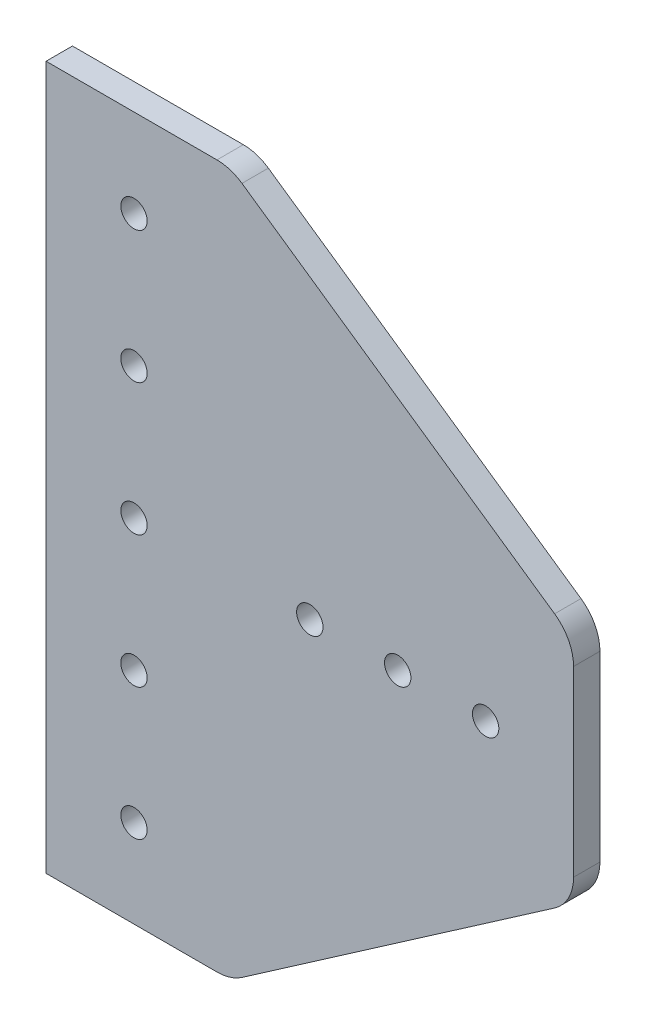
ISO-10303-21;
HEADER;
FILE_DESCRIPTION(('STEP AP214'),'2;1');
FILE_NAME('part.step','',(''),(''),'','','');
FILE_SCHEMA(('AUTOMOTIVE_DESIGN { 1 0 10303 214 1 1 1 1 }'));
ENDSEC;
DATA;
#1=APPLICATION_CONTEXT('core data for automotive mechanical design processes');
#2=APPLICATION_PROTOCOL_DEFINITION('international standard','automotive_design',2000,#1);
#3=PRODUCT_CONTEXT('',#1,'mechanical');
#4=PRODUCT('Part','Part','',(#3));
#5=PRODUCT_RELATED_PRODUCT_CATEGORY('part','',(#4));
#6=PRODUCT_DEFINITION_FORMATION('','',#4);
#7=PRODUCT_DEFINITION_CONTEXT('part definition',#1,'design');
#8=PRODUCT_DEFINITION('design','',#6,#7);
#9=PRODUCT_DEFINITION_SHAPE('','',#8);
#10=(LENGTH_UNIT() NAMED_UNIT(*) SI_UNIT(.MILLI.,.METRE.));
#11=(NAMED_UNIT(*) PLANE_ANGLE_UNIT() SI_UNIT($,.RADIAN.));
#12=(NAMED_UNIT(*) SI_UNIT($,.STERADIAN.) SOLID_ANGLE_UNIT());
#13=UNCERTAINTY_MEASURE_WITH_UNIT(LENGTH_MEASURE(1.E-05),#10,'distance_accuracy_value','');
#14=(GEOMETRIC_REPRESENTATION_CONTEXT(3) GLOBAL_UNCERTAINTY_ASSIGNED_CONTEXT((#13)) GLOBAL_UNIT_ASSIGNED_CONTEXT((#10,
#11,#12)) REPRESENTATION_CONTEXT('',''));
#15=CARTESIAN_POINT('',(0.,0.,0.));
#16=DIRECTION('',(0.,0.,1.));
#17=DIRECTION('',(1.,0.,0.));
#18=AXIS2_PLACEMENT_3D('',#15,#16,#17);
#19=CARTESIAN_POINT('',(0.,0.,1.5));
#20=DIRECTION('',(0.,0.,1.));
#21=DIRECTION('',(1.,0.,0.));
#22=AXIS2_PLACEMENT_3D('',#19,#20,#21);
#23=PLANE('',#22);
#24=CARTESIAN_POINT('',(40.,0.,1.5));
#25=DIRECTION('',(0.,0.,1.));
#26=DIRECTION('',(1.,0.,0.));
#27=AXIS2_PLACEMENT_3D('',#24,#25,#26);
#28=CIRCLE('',#27,1.5);
#29=CARTESIAN_POINT('',(41.5,0.,1.5));
#30=VERTEX_POINT('',#29);
#31=EDGE_CURVE('E306',#30,#30,#28,.T.);
#32=ORIENTED_EDGE('',*,*,#31,.F.);
#33=EDGE_LOOP('',(#32));
#34=FACE_BOUND('',#33,.T.);
#35=CARTESIAN_POINT('',(9.99999999999999,-30.,1.5));
#36=DIRECTION('',(0.,0.,1.));
#37=DIRECTION('',(-1.,0.,0.));
#38=AXIS2_PLACEMENT_3D('',#35,#36,#37);
#39=CIRCLE('',#38,1.5);
#40=CARTESIAN_POINT('',(8.49999999999999,-30.,1.5));
#41=VERTEX_POINT('',#40);
#42=EDGE_CURVE('E290',#41,#41,#39,.T.);
#43=ORIENTED_EDGE('',*,*,#42,.F.);
#44=EDGE_LOOP('',(#43));
#45=FACE_BOUND('',#44,.T.);
#46=CARTESIAN_POINT('',(9.99999999999999,30.,1.5));
#47=DIRECTION('',(0.,0.,1.));
#48=DIRECTION('',(1.,0.,0.));
#49=AXIS2_PLACEMENT_3D('',#46,#47,#48);
#50=CIRCLE('',#49,1.5);
#51=CARTESIAN_POINT('',(11.5,30.,1.5));
#52=VERTEX_POINT('',#51);
#53=EDGE_CURVE('E274',#52,#52,#50,.T.);
#54=ORIENTED_EDGE('',*,*,#53,.F.);
#55=EDGE_LOOP('',(#54));
#56=FACE_BOUND('',#55,.T.);
#57=CARTESIAN_POINT('',(10.,0.,1.5));
#58=DIRECTION('',(0.,0.,1.));
#59=DIRECTION('',(1.,0.,0.));
#60=AXIS2_PLACEMENT_3D('',#57,#58,#59);
#61=CIRCLE('',#60,1.5);
#62=CARTESIAN_POINT('',(11.5,0.,1.5));
#63=VERTEX_POINT('',#62);
#64=EDGE_CURVE('E169',#63,#63,#61,.T.);
#65=ORIENTED_EDGE('',*,*,#64,.F.);
#66=EDGE_LOOP('',(#65));
#67=FACE_BOUND('',#66,.T.);
#68=DIRECTION('',(-0.822192191643779,0.569209978830308,0.));
#69=VECTOR('',#68,1.);
#70=CARTESIAN_POINT('',(60.,13.,1.5));
#71=LINE('',#70,#69);
#72=CARTESIAN_POINT('',(57.8460498941515,14.4911962271259,1.5));
#73=VERTEX_POINT('',#72);
#74=CARTESIAN_POINT('',(22.2841675047949,39.1109609582189,1.5));
#75=VERTEX_POINT('',#74);
#76=EDGE_CURVE('E136',#73,#75,#71,.T.);
#77=ORIENTED_EDGE('',*,*,#76,.T.);
#78=CARTESIAN_POINT('',(19.4381176106434,35.,1.5));
#79=DIRECTION('',(0.,0.,1.));
#80=DIRECTION('',(1.,0.,0.));
#81=AXIS2_PLACEMENT_3D('',#78,#79,#80);
#82=CIRCLE('',#81,5.);
#83=CARTESIAN_POINT('',(19.4381176106434,40.,1.5));
#84=VERTEX_POINT('',#83);
#85=EDGE_CURVE('E131',#75,#84,#82,.T.);
#86=ORIENTED_EDGE('',*,*,#85,.T.);
#87=DIRECTION('',(-1.,0.,0.));
#88=VECTOR('',#87,1.);
#89=CARTESIAN_POINT('',(0.,40.,1.5));
#90=LINE('',#89,#88);
#91=CARTESIAN_POINT('',(0.,40.,1.5));
#92=VERTEX_POINT('',#91);
#93=EDGE_CURVE('E122',#84,#92,#90,.T.);
#94=ORIENTED_EDGE('',*,*,#93,.T.);
#95=DIRECTION('',(0.,-1.,0.));
#96=VECTOR('',#95,1.);
#97=CARTESIAN_POINT('',(0.,40.,1.5));
#98=LINE('',#97,#96);
#99=CARTESIAN_POINT('',(0.,-40.,1.5));
#100=VERTEX_POINT('',#99);
#101=EDGE_CURVE('E128',#92,#100,#98,.T.);
#102=ORIENTED_EDGE('',*,*,#101,.T.);
#103=DIRECTION('',(1.,0.,0.));
#104=VECTOR('',#103,1.);
#105=CARTESIAN_POINT('',(21.,-40.,1.5));
#106=LINE('',#105,#104);
#107=CARTESIAN_POINT('',(19.4381176106434,-40.,1.5));
#108=VERTEX_POINT('',#107);
#109=EDGE_CURVE('E153',#100,#108,#106,.T.);
#110=ORIENTED_EDGE('',*,*,#109,.T.);
#111=CARTESIAN_POINT('',(19.4381176106434,-35.,1.5));
#112=DIRECTION('',(0.,0.,1.));
#113=DIRECTION('',(1.,0.,0.));
#114=AXIS2_PLACEMENT_3D('',#111,#112,#113);
#115=CIRCLE('',#114,5.);
#116=CARTESIAN_POINT('',(22.2841675047949,-39.1109609582189,1.5));
#117=VERTEX_POINT('',#116);
#118=EDGE_CURVE('E214',#108,#117,#115,.T.);
#119=ORIENTED_EDGE('',*,*,#118,.T.);
#120=DIRECTION('',(0.822192191643779,0.569209978830308,0.));
#121=VECTOR('',#120,1.);
#122=CARTESIAN_POINT('',(60.,-13.,1.5));
#123=LINE('',#122,#121);
#124=CARTESIAN_POINT('',(57.8460498941515,-14.4911962271259,1.5));
#125=VERTEX_POINT('',#124);
#126=EDGE_CURVE('E156',#117,#125,#123,.T.);
#127=ORIENTED_EDGE('',*,*,#126,.T.);
#128=CARTESIAN_POINT('',(55.,-10.380235268907,1.5));
#129=DIRECTION('',(0.,0.,1.));
#130=DIRECTION('',(1.,0.,0.));
#131=AXIS2_PLACEMENT_3D('',#128,#129,#130);
#132=CIRCLE('',#131,5.);
#133=CARTESIAN_POINT('',(60.,-10.380235268907,1.5));
#134=VERTEX_POINT('',#133);
#135=EDGE_CURVE('E67',#125,#134,#132,.T.);
#136=ORIENTED_EDGE('',*,*,#135,.T.);
#137=DIRECTION('',(0.,1.,0.));
#138=VECTOR('',#137,1.);
#139=CARTESIAN_POINT('',(60.,13.,1.5));
#140=LINE('',#139,#138);
#141=CARTESIAN_POINT('',(60.,10.380235268907,1.5));
#142=VERTEX_POINT('',#141);
#143=EDGE_CURVE('E162',#134,#142,#140,.T.);
#144=ORIENTED_EDGE('',*,*,#143,.T.);
#145=CARTESIAN_POINT('',(55.,10.380235268907,1.5));
#146=DIRECTION('',(0.,0.,1.));
#147=DIRECTION('',(1.,0.,0.));
#148=AXIS2_PLACEMENT_3D('',#145,#146,#147);
#149=CIRCLE('',#148,5.);
#150=EDGE_CURVE('E209',#142,#73,#149,.T.);
#151=ORIENTED_EDGE('',*,*,#150,.T.);
#152=EDGE_LOOP('',(#77,#86,#94,#102,#110,#119,#127,#136,#144,#151));
#153=FACE_BOUND('',#152,.T.);
#154=CARTESIAN_POINT('',(10.,15.,1.5));
#155=DIRECTION('',(0.,0.,1.));
#156=DIRECTION('',(1.,0.,0.));
#157=AXIS2_PLACEMENT_3D('',#154,#155,#156);
#158=CIRCLE('',#157,1.5);
#159=CARTESIAN_POINT('',(11.5,15.,1.5));
#160=VERTEX_POINT('',#159);
#161=EDGE_CURVE('E266',#160,#160,#158,.T.);
#162=ORIENTED_EDGE('',*,*,#161,.F.);
#163=EDGE_LOOP('',(#162));
#164=FACE_BOUND('',#163,.T.);
#165=CARTESIAN_POINT('',(9.99999999999999,-15.,1.5));
#166=DIRECTION('',(0.,0.,1.));
#167=DIRECTION('',(-1.,0.,0.));
#168=AXIS2_PLACEMENT_3D('',#165,#166,#167);
#169=CIRCLE('',#168,1.5);
#170=CARTESIAN_POINT('',(8.49999999999999,-15.,1.5));
#171=VERTEX_POINT('',#170);
#172=EDGE_CURVE('E282',#171,#171,#169,.T.);
#173=ORIENTED_EDGE('',*,*,#172,.F.);
#174=EDGE_LOOP('',(#173));
#175=FACE_BOUND('',#174,.T.);
#176=CARTESIAN_POINT('',(30.,0.,1.5));
#177=DIRECTION('',(0.,0.,1.));
#178=DIRECTION('',(1.,0.,0.));
#179=AXIS2_PLACEMENT_3D('',#176,#177,#178);
#180=CIRCLE('',#179,1.5);
#181=CARTESIAN_POINT('',(31.5,0.,1.5));
#182=VERTEX_POINT('',#181);
#183=EDGE_CURVE('E298',#182,#182,#180,.T.);
#184=ORIENTED_EDGE('',*,*,#183,.F.);
#185=EDGE_LOOP('',(#184));
#186=FACE_BOUND('',#185,.T.);
#187=CARTESIAN_POINT('',(50.,0.,1.5));
#188=DIRECTION('',(0.,0.,1.));
#189=DIRECTION('',(1.,0.,0.));
#190=AXIS2_PLACEMENT_3D('',#187,#188,#189);
#191=CIRCLE('',#190,1.5);
#192=CARTESIAN_POINT('',(51.5,0.,1.5));
#193=VERTEX_POINT('',#192);
#194=EDGE_CURVE('E314',#193,#193,#191,.T.);
#195=ORIENTED_EDGE('',*,*,#194,.F.);
#196=EDGE_LOOP('',(#195));
#197=FACE_BOUND('',#196,.T.);
#198=ADVANCED_FACE('F45',(#34,#45,#56,#67,#153,#164,#175,#186,#197),#23,.T.);
#199=CARTESIAN_POINT('',(0.,0.,-1.5));
#200=DIRECTION('',(0.,0.,1.));
#201=DIRECTION('',(1.,0.,0.));
#202=AXIS2_PLACEMENT_3D('',#199,#200,#201);
#203=PLANE('',#202);
#204=DIRECTION('',(-1.,0.,0.));
#205=VECTOR('',#204,1.);
#206=CARTESIAN_POINT('',(0.,40.,-1.5));
#207=LINE('',#206,#205);
#208=CARTESIAN_POINT('',(19.4381176106434,40.,-1.5));
#209=VERTEX_POINT('',#208);
#210=CARTESIAN_POINT('',(0.,40.,-1.5));
#211=VERTEX_POINT('',#210);
#212=EDGE_CURVE('E142',#209,#211,#207,.T.);
#213=ORIENTED_EDGE('',*,*,#212,.F.);
#214=CARTESIAN_POINT('',(19.4381176106434,35.,-1.5));
#215=DIRECTION('',(0.,0.,1.));
#216=DIRECTION('',(1.,0.,0.));
#217=AXIS2_PLACEMENT_3D('',#214,#215,#216);
#218=CIRCLE('',#217,5.);
#219=CARTESIAN_POINT('',(22.2841675047949,39.1109609582189,-1.5));
#220=VERTEX_POINT('',#219);
#221=EDGE_CURVE('E199',#209,#220,#218,.F.);
#222=ORIENTED_EDGE('',*,*,#221,.T.);
#223=DIRECTION('',(-0.822192191643779,0.569209978830308,0.));
#224=VECTOR('',#223,1.);
#225=CARTESIAN_POINT('',(60.,13.,-1.5));
#226=LINE('',#225,#224);
#227=CARTESIAN_POINT('',(57.8460498941515,14.4911962271259,-1.5));
#228=VERTEX_POINT('',#227);
#229=EDGE_CURVE('E165',#228,#220,#226,.T.);
#230=ORIENTED_EDGE('',*,*,#229,.F.);
#231=CARTESIAN_POINT('',(55.,10.380235268907,-1.5));
#232=DIRECTION('',(0.,0.,1.));
#233=DIRECTION('',(1.,0.,0.));
#234=AXIS2_PLACEMENT_3D('',#231,#232,#233);
#235=CIRCLE('',#234,5.);
#236=CARTESIAN_POINT('',(60.,10.380235268907,-1.5));
#237=VERTEX_POINT('',#236);
#238=EDGE_CURVE('E190',#228,#237,#235,.F.);
#239=ORIENTED_EDGE('',*,*,#238,.T.);
#240=DIRECTION('',(0.,1.,0.));
#241=VECTOR('',#240,1.);
#242=CARTESIAN_POINT('',(60.,13.,-1.5));
#243=LINE('',#242,#241);
#244=CARTESIAN_POINT('',(60.,-10.380235268907,-1.5));
#245=VERTEX_POINT('',#244);
#246=EDGE_CURVE('E183',#245,#237,#243,.T.);
#247=ORIENTED_EDGE('',*,*,#246,.F.);
#248=CARTESIAN_POINT('',(55.,-10.380235268907,-1.5));
#249=DIRECTION('',(0.,0.,1.));
#250=DIRECTION('',(1.,0.,0.));
#251=AXIS2_PLACEMENT_3D('',#248,#249,#250);
#252=CIRCLE('',#251,5.);
#253=CARTESIAN_POINT('',(57.8460498941515,-14.4911962271259,-1.5));
#254=VERTEX_POINT('',#253);
#255=EDGE_CURVE('E193',#245,#254,#252,.F.);
#256=ORIENTED_EDGE('',*,*,#255,.T.);
#257=DIRECTION('',(0.822192191643779,0.569209978830308,0.));
#258=VECTOR('',#257,1.);
#259=CARTESIAN_POINT('',(60.,-13.,-1.5));
#260=LINE('',#259,#258);
#261=CARTESIAN_POINT('',(22.2841675047949,-39.1109609582189,-1.5));
#262=VERTEX_POINT('',#261);
#263=EDGE_CURVE('E179',#262,#254,#260,.T.);
#264=ORIENTED_EDGE('',*,*,#263,.F.);
#265=CARTESIAN_POINT('',(19.4381176106434,-35.,-1.5));
#266=DIRECTION('',(0.,0.,1.));
#267=DIRECTION('',(1.,0.,0.));
#268=AXIS2_PLACEMENT_3D('',#265,#266,#267);
#269=CIRCLE('',#268,5.);
#270=CARTESIAN_POINT('',(19.4381176106434,-40.,-1.5));
#271=VERTEX_POINT('',#270);
#272=EDGE_CURVE('E196',#262,#271,#269,.F.);
#273=ORIENTED_EDGE('',*,*,#272,.T.);
#274=DIRECTION('',(1.,0.,0.));
#275=VECTOR('',#274,1.);
#276=CARTESIAN_POINT('',(21.,-40.,-1.5));
#277=LINE('',#276,#275);
#278=CARTESIAN_POINT('',(0.,-40.,-1.5));
#279=VERTEX_POINT('',#278);
#280=EDGE_CURVE('E175',#279,#271,#277,.T.);
#281=ORIENTED_EDGE('',*,*,#280,.F.);
#282=DIRECTION('',(0.,-1.,0.));
#283=VECTOR('',#282,1.);
#284=CARTESIAN_POINT('',(0.,40.,-1.5));
#285=LINE('',#284,#283);
#286=EDGE_CURVE('E172',#211,#279,#285,.T.);
#287=ORIENTED_EDGE('',*,*,#286,.F.);
#288=EDGE_LOOP('',(#213,#222,#230,#239,#247,#256,#264,#273,#281,#287));
#289=FACE_BOUND('',#288,.T.);
#290=CARTESIAN_POINT('',(10.,0.,-1.5));
#291=DIRECTION('',(0.,0.,1.));
#292=DIRECTION('',(1.,0.,0.));
#293=AXIS2_PLACEMENT_3D('',#290,#291,#292);
#294=CIRCLE('',#293,1.5);
#295=CARTESIAN_POINT('',(11.5,0.,-1.5));
#296=VERTEX_POINT('',#295);
#297=EDGE_CURVE('E262',#296,#296,#294,.T.);
#298=ORIENTED_EDGE('',*,*,#297,.T.);
#299=EDGE_LOOP('',(#298));
#300=FACE_BOUND('',#299,.T.);
#301=CARTESIAN_POINT('',(10.,15.,-1.5));
#302=DIRECTION('',(0.,0.,1.));
#303=DIRECTION('',(1.,0.,0.));
#304=AXIS2_PLACEMENT_3D('',#301,#302,#303);
#305=CIRCLE('',#304,1.5);
#306=CARTESIAN_POINT('',(11.5,15.,-1.5));
#307=VERTEX_POINT('',#306);
#308=EDGE_CURVE('E270',#307,#307,#305,.T.);
#309=ORIENTED_EDGE('',*,*,#308,.T.);
#310=EDGE_LOOP('',(#309));
#311=FACE_BOUND('',#310,.T.);
#312=CARTESIAN_POINT('',(9.99999999999999,30.,-1.5));
#313=DIRECTION('',(0.,0.,1.));
#314=DIRECTION('',(1.,0.,0.));
#315=AXIS2_PLACEMENT_3D('',#312,#313,#314);
#316=CIRCLE('',#315,1.5);
#317=CARTESIAN_POINT('',(11.5,30.,-1.5));
#318=VERTEX_POINT('',#317);
#319=EDGE_CURVE('E278',#318,#318,#316,.T.);
#320=ORIENTED_EDGE('',*,*,#319,.T.);
#321=EDGE_LOOP('',(#320));
#322=FACE_BOUND('',#321,.T.);
#323=CARTESIAN_POINT('',(9.99999999999999,-15.,-1.5));
#324=DIRECTION('',(0.,0.,1.));
#325=DIRECTION('',(-1.,0.,0.));
#326=AXIS2_PLACEMENT_3D('',#323,#324,#325);
#327=CIRCLE('',#326,1.5);
#328=CARTESIAN_POINT('',(8.49999999999999,-15.,-1.5));
#329=VERTEX_POINT('',#328);
#330=EDGE_CURVE('E286',#329,#329,#327,.T.);
#331=ORIENTED_EDGE('',*,*,#330,.T.);
#332=EDGE_LOOP('',(#331));
#333=FACE_BOUND('',#332,.T.);
#334=CARTESIAN_POINT('',(9.99999999999999,-30.,-1.5));
#335=DIRECTION('',(0.,0.,1.));
#336=DIRECTION('',(-1.,0.,0.));
#337=AXIS2_PLACEMENT_3D('',#334,#335,#336);
#338=CIRCLE('',#337,1.5);
#339=CARTESIAN_POINT('',(8.49999999999999,-30.,-1.5));
#340=VERTEX_POINT('',#339);
#341=EDGE_CURVE('E294',#340,#340,#338,.T.);
#342=ORIENTED_EDGE('',*,*,#341,.T.);
#343=EDGE_LOOP('',(#342));
#344=FACE_BOUND('',#343,.T.);
#345=CARTESIAN_POINT('',(30.,0.,-1.5));
#346=DIRECTION('',(0.,0.,1.));
#347=DIRECTION('',(1.,0.,0.));
#348=AXIS2_PLACEMENT_3D('',#345,#346,#347);
#349=CIRCLE('',#348,1.5);
#350=CARTESIAN_POINT('',(31.5,0.,-1.5));
#351=VERTEX_POINT('',#350);
#352=EDGE_CURVE('E302',#351,#351,#349,.T.);
#353=ORIENTED_EDGE('',*,*,#352,.T.);
#354=EDGE_LOOP('',(#353));
#355=FACE_BOUND('',#354,.T.);
#356=CARTESIAN_POINT('',(40.,0.,-1.5));
#357=DIRECTION('',(0.,0.,1.));
#358=DIRECTION('',(1.,0.,0.));
#359=AXIS2_PLACEMENT_3D('',#356,#357,#358);
#360=CIRCLE('',#359,1.5);
#361=CARTESIAN_POINT('',(41.5,0.,-1.5));
#362=VERTEX_POINT('',#361);
#363=EDGE_CURVE('E310',#362,#362,#360,.T.);
#364=ORIENTED_EDGE('',*,*,#363,.T.);
#365=EDGE_LOOP('',(#364));
#366=FACE_BOUND('',#365,.T.);
#367=CARTESIAN_POINT('',(50.,0.,-1.5));
#368=DIRECTION('',(0.,0.,1.));
#369=DIRECTION('',(1.,0.,0.));
#370=AXIS2_PLACEMENT_3D('',#367,#368,#369);
#371=CIRCLE('',#370,1.5);
#372=CARTESIAN_POINT('',(51.5,0.,-1.5));
#373=VERTEX_POINT('',#372);
#374=EDGE_CURVE('E318',#373,#373,#371,.T.);
#375=ORIENTED_EDGE('',*,*,#374,.T.);
#376=EDGE_LOOP('',(#375));
#377=FACE_BOUND('',#376,.T.);
#378=ADVANCED_FACE('F243',(#289,#300,#311,#322,#333,#344,#355,#366,#377),#203,.F.);
#379=CARTESIAN_POINT('',(60.,13.,1.5));
#380=DIRECTION('',(-0.569209978830308,-0.822192191643779,0.));
#381=DIRECTION('',(0.822192191643779,-0.569209978830308,0.));
#382=AXIS2_PLACEMENT_3D('',#379,#380,#381);
#383=PLANE('',#382);
#384=ORIENTED_EDGE('',*,*,#229,.T.);
#385=DIRECTION('',(0.,0.,-1.));
#386=VECTOR('',#385,1.);
#387=CARTESIAN_POINT('',(22.2841675047949,39.1109609582189,1.5));
#388=LINE('',#387,#386);
#389=EDGE_CURVE('E206',#220,#75,#388,.F.);
#390=ORIENTED_EDGE('',*,*,#389,.T.);
#391=ORIENTED_EDGE('',*,*,#76,.F.);
#392=DIRECTION('',(0.,0.,-1.));
#393=VECTOR('',#392,1.);
#394=CARTESIAN_POINT('',(57.8460498941515,14.4911962271259,1.5));
#395=LINE('',#394,#393);
#396=EDGE_CURVE('E202',#73,#228,#395,.T.);
#397=ORIENTED_EDGE('',*,*,#396,.T.);
#398=EDGE_LOOP('',(#384,#390,#391,#397));
#399=FACE_BOUND('',#398,.T.);
#400=ADVANCED_FACE('F256',(#399),#383,.F.);
#401=CARTESIAN_POINT('',(0.,40.,1.5));
#402=DIRECTION('',(0.,-1.,0.));
#403=DIRECTION('',(0.,0.,-1.));
#404=AXIS2_PLACEMENT_3D('',#401,#402,#403);
#405=PLANE('',#404);
#406=ORIENTED_EDGE('',*,*,#93,.F.);
#407=DIRECTION('',(0.,0.,-1.));
#408=VECTOR('',#407,1.);
#409=CARTESIAN_POINT('',(19.4381176106434,40.,1.5));
#410=LINE('',#409,#408);
#411=EDGE_CURVE('E146',#84,#209,#410,.T.);
#412=ORIENTED_EDGE('',*,*,#411,.T.);
#413=ORIENTED_EDGE('',*,*,#212,.T.);
#414=DIRECTION('',(0.,0.,-1.));
#415=VECTOR('',#414,1.);
#416=CARTESIAN_POINT('',(0.,40.,1.5));
#417=LINE('',#416,#415);
#418=EDGE_CURVE('E139',#92,#211,#417,.T.);
#419=ORIENTED_EDGE('',*,*,#418,.F.);
#420=EDGE_LOOP('',(#406,#412,#413,#419));
#421=FACE_BOUND('',#420,.T.);
#422=ADVANCED_FACE('F140',(#421),#405,.F.);
#423=CARTESIAN_POINT('',(0.,40.,1.5));
#424=DIRECTION('',(1.,0.,0.));
#425=DIRECTION('',(0.,0.,-1.));
#426=AXIS2_PLACEMENT_3D('',#423,#424,#425);
#427=PLANE('',#426);
#428=ORIENTED_EDGE('',*,*,#286,.T.);
#429=DIRECTION('',(0.,0.,-1.));
#430=VECTOR('',#429,1.);
#431=CARTESIAN_POINT('',(0.,-40.,1.5));
#432=LINE('',#431,#430);
#433=EDGE_CURVE('E147',#100,#279,#432,.T.);
#434=ORIENTED_EDGE('',*,*,#433,.F.);
#435=ORIENTED_EDGE('',*,*,#101,.F.);
#436=ORIENTED_EDGE('',*,*,#418,.T.);
#437=EDGE_LOOP('',(#428,#434,#435,#436));
#438=FACE_BOUND('',#437,.T.);
#439=ADVANCED_FACE('F149',(#438),#427,.F.);
#440=CARTESIAN_POINT('',(21.,-40.,1.5));
#441=DIRECTION('',(0.,1.,0.));
#442=DIRECTION('',(-1.,0.,0.));
#443=AXIS2_PLACEMENT_3D('',#440,#441,#442);
#444=PLANE('',#443);
#445=ORIENTED_EDGE('',*,*,#280,.T.);
#446=DIRECTION('',(0.,0.,-1.));
#447=VECTOR('',#446,1.);
#448=CARTESIAN_POINT('',(19.4381176106434,-40.,1.5));
#449=LINE('',#448,#447);
#450=EDGE_CURVE('E226',#271,#108,#449,.F.);
#451=ORIENTED_EDGE('',*,*,#450,.T.);
#452=ORIENTED_EDGE('',*,*,#109,.F.);
#453=ORIENTED_EDGE('',*,*,#433,.T.);
#454=EDGE_LOOP('',(#445,#451,#452,#453));
#455=FACE_BOUND('',#454,.T.);
#456=ADVANCED_FACE('F231',(#455),#444,.F.);
#457=CARTESIAN_POINT('',(60.,-13.,1.5));
#458=DIRECTION('',(-0.569209978830308,0.822192191643779,0.));
#459=DIRECTION('',(-0.822192191643779,-0.569209978830308,0.));
#460=AXIS2_PLACEMENT_3D('',#457,#458,#459);
#461=PLANE('',#460);
#462=ORIENTED_EDGE('',*,*,#126,.F.);
#463=DIRECTION('',(0.,0.,-1.));
#464=VECTOR('',#463,1.);
#465=CARTESIAN_POINT('',(22.2841675047949,-39.1109609582189,1.5));
#466=LINE('',#465,#464);
#467=EDGE_CURVE('E222',#117,#262,#466,.T.);
#468=ORIENTED_EDGE('',*,*,#467,.T.);
#469=ORIENTED_EDGE('',*,*,#263,.T.);
#470=DIRECTION('',(0.,0.,-1.));
#471=VECTOR('',#470,1.);
#472=CARTESIAN_POINT('',(57.8460498941515,-14.4911962271259,1.5));
#473=LINE('',#472,#471);
#474=EDGE_CURVE('E219',#254,#125,#473,.F.);
#475=ORIENTED_EDGE('',*,*,#474,.T.);
#476=EDGE_LOOP('',(#462,#468,#469,#475));
#477=FACE_BOUND('',#476,.T.);
#478=ADVANCED_FACE('F240',(#477),#461,.F.);
#479=CARTESIAN_POINT('',(60.,13.,1.5));
#480=DIRECTION('',(-1.,0.,0.));
#481=DIRECTION('',(0.,-1.,0.));
#482=AXIS2_PLACEMENT_3D('',#479,#480,#481);
#483=PLANE('',#482);
#484=ORIENTED_EDGE('',*,*,#143,.F.);
#485=DIRECTION('',(0.,0.,-1.));
#486=VECTOR('',#485,1.);
#487=CARTESIAN_POINT('',(60.,-10.380235268907,1.5));
#488=LINE('',#487,#486);
#489=EDGE_CURVE('E11',#134,#245,#488,.T.);
#490=ORIENTED_EDGE('',*,*,#489,.T.);
#491=ORIENTED_EDGE('',*,*,#246,.T.);
#492=DIRECTION('',(0.,0.,-1.));
#493=VECTOR('',#492,1.);
#494=CARTESIAN_POINT('',(60.,10.380235268907,1.5));
#495=LINE('',#494,#493);
#496=EDGE_CURVE('E54',#237,#142,#495,.F.);
#497=ORIENTED_EDGE('',*,*,#496,.T.);
#498=EDGE_LOOP('',(#484,#490,#491,#497));
#499=FACE_BOUND('',#498,.T.);
#500=ADVANCED_FACE('F249',(#499),#483,.F.);
#501=CARTESIAN_POINT('',(10.,0.,1.5));
#502=DIRECTION('',(0.,0.,-1.));
#503=DIRECTION('',(-1.,0.,0.));
#504=AXIS2_PLACEMENT_3D('',#501,#502,#503);
#505=CYLINDRICAL_SURFACE('',#504,1.5);
#506=ORIENTED_EDGE('',*,*,#64,.T.);
#507=EDGE_LOOP('',(#506));
#508=FACE_BOUND('',#507,.T.);
#509=ORIENTED_EDGE('',*,*,#297,.F.);
#510=EDGE_LOOP('',(#509));
#511=FACE_BOUND('',#510,.T.);
#512=ADVANCED_FACE('F340',(#508,#511),#505,.F.);
#513=CARTESIAN_POINT('',(10.,15.,1.5));
#514=DIRECTION('',(0.,0.,-1.));
#515=DIRECTION('',(-1.,0.,0.));
#516=AXIS2_PLACEMENT_3D('',#513,#514,#515);
#517=CYLINDRICAL_SURFACE('',#516,1.5);
#518=ORIENTED_EDGE('',*,*,#161,.T.);
#519=EDGE_LOOP('',(#518));
#520=FACE_BOUND('',#519,.T.);
#521=ORIENTED_EDGE('',*,*,#308,.F.);
#522=EDGE_LOOP('',(#521));
#523=FACE_BOUND('',#522,.T.);
#524=ADVANCED_FACE('F438',(#520,#523),#517,.F.);
#525=CARTESIAN_POINT('',(9.99999999999999,30.,1.5));
#526=DIRECTION('',(0.,0.,-1.));
#527=DIRECTION('',(-1.,0.,0.));
#528=AXIS2_PLACEMENT_3D('',#525,#526,#527);
#529=CYLINDRICAL_SURFACE('',#528,1.5);
#530=ORIENTED_EDGE('',*,*,#53,.T.);
#531=EDGE_LOOP('',(#530));
#532=FACE_BOUND('',#531,.T.);
#533=ORIENTED_EDGE('',*,*,#319,.F.);
#534=EDGE_LOOP('',(#533));
#535=FACE_BOUND('',#534,.T.);
#536=ADVANCED_FACE('F428',(#532,#535),#529,.F.);
#537=CARTESIAN_POINT('',(9.99999999999999,-15.,1.5));
#538=DIRECTION('',(0.,0.,-1.));
#539=DIRECTION('',(-1.,0.,0.));
#540=AXIS2_PLACEMENT_3D('',#537,#538,#539);
#541=CYLINDRICAL_SURFACE('',#540,1.5);
#542=ORIENTED_EDGE('',*,*,#172,.T.);
#543=EDGE_LOOP('',(#542));
#544=FACE_BOUND('',#543,.T.);
#545=ORIENTED_EDGE('',*,*,#330,.F.);
#546=EDGE_LOOP('',(#545));
#547=FACE_BOUND('',#546,.T.);
#548=ADVANCED_FACE('F418',(#544,#547),#541,.F.);
#549=CARTESIAN_POINT('',(9.99999999999999,-30.,1.5));
#550=DIRECTION('',(0.,0.,-1.));
#551=DIRECTION('',(-1.,0.,0.));
#552=AXIS2_PLACEMENT_3D('',#549,#550,#551);
#553=CYLINDRICAL_SURFACE('',#552,1.5);
#554=ORIENTED_EDGE('',*,*,#42,.T.);
#555=EDGE_LOOP('',(#554));
#556=FACE_BOUND('',#555,.T.);
#557=ORIENTED_EDGE('',*,*,#341,.F.);
#558=EDGE_LOOP('',(#557));
#559=FACE_BOUND('',#558,.T.);
#560=ADVANCED_FACE('F408',(#556,#559),#553,.F.);
#561=CARTESIAN_POINT('',(30.,0.,1.5));
#562=DIRECTION('',(0.,0.,-1.));
#563=DIRECTION('',(-1.,0.,0.));
#564=AXIS2_PLACEMENT_3D('',#561,#562,#563);
#565=CYLINDRICAL_SURFACE('',#564,1.5);
#566=ORIENTED_EDGE('',*,*,#183,.T.);
#567=EDGE_LOOP('',(#566));
#568=FACE_BOUND('',#567,.T.);
#569=ORIENTED_EDGE('',*,*,#352,.F.);
#570=EDGE_LOOP('',(#569));
#571=FACE_BOUND('',#570,.T.);
#572=ADVANCED_FACE('F398',(#568,#571),#565,.F.);
#573=CARTESIAN_POINT('',(40.,0.,1.5));
#574=DIRECTION('',(0.,0.,-1.));
#575=DIRECTION('',(-1.,0.,0.));
#576=AXIS2_PLACEMENT_3D('',#573,#574,#575);
#577=CYLINDRICAL_SURFACE('',#576,1.5);
#578=ORIENTED_EDGE('',*,*,#31,.T.);
#579=EDGE_LOOP('',(#578));
#580=FACE_BOUND('',#579,.T.);
#581=ORIENTED_EDGE('',*,*,#363,.F.);
#582=EDGE_LOOP('',(#581));
#583=FACE_BOUND('',#582,.T.);
#584=ADVANCED_FACE('F389',(#580,#583),#577,.F.);
#585=CARTESIAN_POINT('',(50.,0.,1.5));
#586=DIRECTION('',(0.,0.,-1.));
#587=DIRECTION('',(-1.,0.,0.));
#588=AXIS2_PLACEMENT_3D('',#585,#586,#587);
#589=CYLINDRICAL_SURFACE('',#588,1.5);
#590=ORIENTED_EDGE('',*,*,#194,.T.);
#591=EDGE_LOOP('',(#590));
#592=FACE_BOUND('',#591,.T.);
#593=ORIENTED_EDGE('',*,*,#374,.F.);
#594=EDGE_LOOP('',(#593));
#595=FACE_BOUND('',#594,.T.);
#596=ADVANCED_FACE('F326',(#592,#595),#589,.F.);
#597=CARTESIAN_POINT('',(19.4381176106434,35.,1.5));
#598=DIRECTION('',(0.,0.,-1.));
#599=DIRECTION('',(-1.,0.,0.));
#600=AXIS2_PLACEMENT_3D('',#597,#598,#599);
#601=CYLINDRICAL_SURFACE('',#600,5.);
#602=ORIENTED_EDGE('',*,*,#85,.F.);
#603=ORIENTED_EDGE('',*,*,#389,.F.);
#604=ORIENTED_EDGE('',*,*,#221,.F.);
#605=ORIENTED_EDGE('',*,*,#411,.F.);
#606=EDGE_LOOP('',(#602,#603,#604,#605));
#607=FACE_BOUND('',#606,.T.);
#608=ADVANCED_FACE('F259',(#607),#601,.T.);
#609=CARTESIAN_POINT('',(19.4381176106434,-35.,1.5));
#610=DIRECTION('',(0.,0.,-1.));
#611=DIRECTION('',(-1.,0.,0.));
#612=AXIS2_PLACEMENT_3D('',#609,#610,#611);
#613=CYLINDRICAL_SURFACE('',#612,5.);
#614=ORIENTED_EDGE('',*,*,#118,.F.);
#615=ORIENTED_EDGE('',*,*,#450,.F.);
#616=ORIENTED_EDGE('',*,*,#272,.F.);
#617=ORIENTED_EDGE('',*,*,#467,.F.);
#618=EDGE_LOOP('',(#614,#615,#616,#617));
#619=FACE_BOUND('',#618,.T.);
#620=ADVANCED_FACE('F237',(#619),#613,.T.);
#621=CARTESIAN_POINT('',(55.,-10.380235268907,1.5));
#622=DIRECTION('',(0.,0.,-1.));
#623=DIRECTION('',(-1.,0.,0.));
#624=AXIS2_PLACEMENT_3D('',#621,#622,#623);
#625=CYLINDRICAL_SURFACE('',#624,5.);
#626=ORIENTED_EDGE('',*,*,#135,.F.);
#627=ORIENTED_EDGE('',*,*,#474,.F.);
#628=ORIENTED_EDGE('',*,*,#255,.F.);
#629=ORIENTED_EDGE('',*,*,#489,.F.);
#630=EDGE_LOOP('',(#626,#627,#628,#629));
#631=FACE_BOUND('',#630,.T.);
#632=ADVANCED_FACE('F248',(#631),#625,.T.);
#633=CARTESIAN_POINT('',(55.,10.380235268907,1.5));
#634=DIRECTION('',(0.,0.,-1.));
#635=DIRECTION('',(-1.,0.,0.));
#636=AXIS2_PLACEMENT_3D('',#633,#634,#635);
#637=CYLINDRICAL_SURFACE('',#636,5.);
#638=ORIENTED_EDGE('',*,*,#150,.F.);
#639=ORIENTED_EDGE('',*,*,#496,.F.);
#640=ORIENTED_EDGE('',*,*,#238,.F.);
#641=ORIENTED_EDGE('',*,*,#396,.F.);
#642=EDGE_LOOP('',(#638,#639,#640,#641));
#643=FACE_BOUND('',#642,.T.);
#644=ADVANCED_FACE('F47',(#643),#637,.T.);
#645=CLOSED_SHELL('',(#198,#378,#400,#422,#439,#456,#478,#500,#512,#524,#536,#548,#560,#572,
#584,#596,#608,#620,#632,#644));
#646=MANIFOLD_SOLID_BREP('B2',#645);
#647=ADVANCED_BREP_SHAPE_REPRESENTATION('',(#18,#646),#14);
#648=SHAPE_DEFINITION_REPRESENTATION(#9,#647);
ENDSEC;
END-ISO-10303-21;
